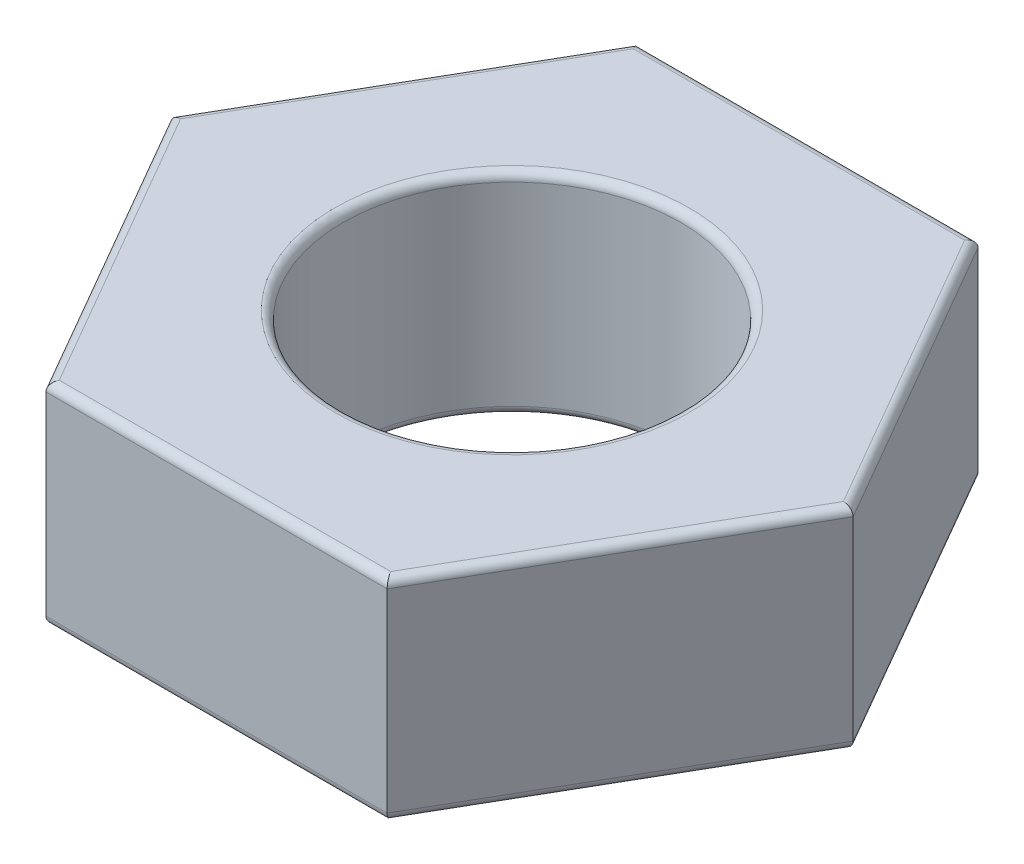
ISO-10303-21;
HEADER;
FILE_DESCRIPTION(('STEP AP214'),'2;1');
FILE_NAME('part.step','',(''),(''),'','','');
FILE_SCHEMA(('AUTOMOTIVE_DESIGN { 1 0 10303 214 1 1 1 1 }'));
ENDSEC;
DATA;
#1=APPLICATION_CONTEXT('core data for automotive mechanical design processes');
#2=APPLICATION_PROTOCOL_DEFINITION('international standard','automotive_design',2000,#1);
#3=PRODUCT_CONTEXT('',#1,'mechanical');
#4=PRODUCT('Part','Part','',(#3));
#5=PRODUCT_RELATED_PRODUCT_CATEGORY('part','',(#4));
#6=PRODUCT_DEFINITION_FORMATION('','',#4);
#7=PRODUCT_DEFINITION_CONTEXT('part definition',#1,'design');
#8=PRODUCT_DEFINITION('design','',#6,#7);
#9=PRODUCT_DEFINITION_SHAPE('','',#8);
#10=(LENGTH_UNIT() NAMED_UNIT(*) SI_UNIT(.MILLI.,.METRE.));
#11=(NAMED_UNIT(*) PLANE_ANGLE_UNIT() SI_UNIT($,.RADIAN.));
#12=(NAMED_UNIT(*) SI_UNIT($,.STERADIAN.) SOLID_ANGLE_UNIT());
#13=UNCERTAINTY_MEASURE_WITH_UNIT(LENGTH_MEASURE(1.E-05),#10,'distance_accuracy_value','');
#14=(GEOMETRIC_REPRESENTATION_CONTEXT(3) GLOBAL_UNCERTAINTY_ASSIGNED_CONTEXT((#13)) GLOBAL_UNIT_ASSIGNED_CONTEXT((#10,
#11,#12)) REPRESENTATION_CONTEXT('',''));
#15=CARTESIAN_POINT('',(0.,0.,0.));
#16=DIRECTION('',(0.,0.,1.));
#17=DIRECTION('',(1.,0.,0.));
#18=AXIS2_PLACEMENT_3D('',#15,#16,#17);
#19=CARTESIAN_POINT('',(0.,2.5,0.));
#20=DIRECTION('',(0.,1.,0.));
#21=DIRECTION('',(0.,0.,1.));
#22=AXIS2_PLACEMENT_3D('',#19,#20,#21);
#23=PLANE('',#22);
#24=CARTESIAN_POINT('',(0.,2.5,0.));
#25=DIRECTION('',(0.,1.,0.));
#26=DIRECTION('',(0.,0.,1.));
#27=AXIS2_PLACEMENT_3D('',#24,#25,#26);
#28=CIRCLE('',#27,2.1);
#29=CARTESIAN_POINT('',(0.,2.5,2.1));
#30=VERTEX_POINT('',#29);
#31=EDGE_CURVE('E11',#30,#30,#28,.F.);
#32=ORIENTED_EDGE('',*,*,#31,.T.);
#33=EDGE_LOOP('',(#32));
#34=FACE_BOUND('',#33,.T.);
#35=DIRECTION('',(-0.5,0.,0.866025403784439));
#36=VECTOR('',#35,1.);
#37=CARTESIAN_POINT('',(-3.95484934394894,2.5,0.0500000000000008));
#38=LINE('',#37,#36);
#39=CARTESIAN_POINT('',(-1.96299091524473,2.5,-3.4));
#40=VERTEX_POINT('',#39);
#41=CARTESIAN_POINT('',(-3.92598183048946,2.5,0.));
#42=VERTEX_POINT('',#41);
#43=EDGE_CURVE('E50',#40,#42,#38,.T.);
#44=ORIENTED_EDGE('',*,*,#43,.T.);
#45=DIRECTION('',(0.5,0.,0.866025403784439));
#46=VECTOR('',#45,1.);
#47=CARTESIAN_POINT('',(-1.93412340178525,2.5,3.45));
#48=LINE('',#47,#46);
#49=CARTESIAN_POINT('',(-1.96299091524473,2.5,3.4));
#50=VERTEX_POINT('',#49);
#51=EDGE_CURVE('E42',#42,#50,#48,.T.);
#52=ORIENTED_EDGE('',*,*,#51,.T.);
#53=DIRECTION('',(1.,0.,0.));
#54=VECTOR('',#53,1.);
#55=CARTESIAN_POINT('',(2.02072594216369,2.5,3.4));
#56=LINE('',#55,#54);
#57=CARTESIAN_POINT('',(1.96299091524473,2.5,3.4));
#58=VERTEX_POINT('',#57);
#59=EDGE_CURVE('E189',#50,#58,#56,.T.);
#60=ORIENTED_EDGE('',*,*,#59,.T.);
#61=DIRECTION('',(0.5,0.,-0.866025403784439));
#62=VECTOR('',#61,1.);
#63=CARTESIAN_POINT('',(3.95484934394894,2.5,-0.0500000000000021));
#64=LINE('',#63,#62);
#65=CARTESIAN_POINT('',(3.92598183048946,2.5,0.));
#66=VERTEX_POINT('',#65);
#67=EDGE_CURVE('E191',#58,#66,#64,.T.);
#68=ORIENTED_EDGE('',*,*,#67,.T.);
#69=DIRECTION('',(-0.5,0.,-0.866025403784438));
#70=VECTOR('',#69,1.);
#71=CARTESIAN_POINT('',(1.93412340178524,2.5,-3.45));
#72=LINE('',#71,#70);
#73=CARTESIAN_POINT('',(1.96299091524473,2.5,-3.4));
#74=VERTEX_POINT('',#73);
#75=EDGE_CURVE('E193',#66,#74,#72,.T.);
#76=ORIENTED_EDGE('',*,*,#75,.T.);
#77=DIRECTION('',(-1.,0.,0.));
#78=VECTOR('',#77,1.);
#79=CARTESIAN_POINT('',(-2.02072594216369,2.5,-3.4));
#80=LINE('',#79,#78);
#81=EDGE_CURVE('E55',#74,#40,#80,.T.);
#82=ORIENTED_EDGE('',*,*,#81,.T.);
#83=EDGE_LOOP('',(#44,#52,#60,#68,#76,#82));
#84=FACE_BOUND('',#83,.T.);
#85=ADVANCED_FACE('F33',(#34,#84),#23,.T.);
#86=CARTESIAN_POINT('',(0.,0.,0.));
#87=DIRECTION('',(0.,1.,0.));
#88=DIRECTION('',(0.,0.,1.));
#89=AXIS2_PLACEMENT_3D('',#86,#87,#88);
#90=PLANE('',#89);
#91=CARTESIAN_POINT('',(0.,0.,0.));
#92=DIRECTION('',(0.,1.,0.));
#93=DIRECTION('',(0.,0.,1.));
#94=AXIS2_PLACEMENT_3D('',#91,#92,#93);
#95=CIRCLE('',#94,2.1);
#96=CARTESIAN_POINT('',(0.,0.,2.1));
#97=VERTEX_POINT('',#96);
#98=EDGE_CURVE('E151',#97,#97,#95,.T.);
#99=ORIENTED_EDGE('',*,*,#98,.T.);
#100=EDGE_LOOP('',(#99));
#101=FACE_BOUND('',#100,.T.);
#102=DIRECTION('',(-0.5,0.,-0.866025403784438));
#103=VECTOR('',#102,1.);
#104=CARTESIAN_POINT('',(2.94448637286709,0.,-1.7));
#105=LINE('',#104,#103);
#106=CARTESIAN_POINT('',(1.96299091524473,0.,-3.4));
#107=VERTEX_POINT('',#106);
#108=CARTESIAN_POINT('',(3.92598183048946,0.,0.));
#109=VERTEX_POINT('',#108);
#110=EDGE_CURVE('E150',#107,#109,#105,.F.);
#111=ORIENTED_EDGE('',*,*,#110,.T.);
#112=DIRECTION('',(0.5,0.,-0.866025403784439));
#113=VECTOR('',#112,1.);
#114=CARTESIAN_POINT('',(2.94448637286709,0.,1.7));
#115=LINE('',#114,#113);
#116=CARTESIAN_POINT('',(1.96299091524473,0.,3.4));
#117=VERTEX_POINT('',#116);
#118=EDGE_CURVE('E129',#109,#117,#115,.F.);
#119=ORIENTED_EDGE('',*,*,#118,.T.);
#120=DIRECTION('',(1.,0.,0.));
#121=VECTOR('',#120,1.);
#122=CARTESIAN_POINT('',(0.,0.,3.4));
#123=LINE('',#122,#121);
#124=CARTESIAN_POINT('',(-1.96299091524473,0.,3.4));
#125=VERTEX_POINT('',#124);
#126=EDGE_CURVE('E139',#117,#125,#123,.F.);
#127=ORIENTED_EDGE('',*,*,#126,.T.);
#128=DIRECTION('',(0.5,0.,0.866025403784439));
#129=VECTOR('',#128,1.);
#130=CARTESIAN_POINT('',(-2.94448637286709,0.,1.7));
#131=LINE('',#130,#129);
#132=CARTESIAN_POINT('',(-3.92598183048946,0.,0.));
#133=VERTEX_POINT('',#132);
#134=EDGE_CURVE('E145',#125,#133,#131,.F.);
#135=ORIENTED_EDGE('',*,*,#134,.T.);
#136=DIRECTION('',(-0.5,0.,0.866025403784439));
#137=VECTOR('',#136,1.);
#138=CARTESIAN_POINT('',(-2.94448637286709,0.,-1.7));
#139=LINE('',#138,#137);
#140=CARTESIAN_POINT('',(-1.96299091524473,0.,-3.4));
#141=VERTEX_POINT('',#140);
#142=EDGE_CURVE('E251',#133,#141,#139,.F.);
#143=ORIENTED_EDGE('',*,*,#142,.T.);
#144=DIRECTION('',(-1.,0.,0.));
#145=VECTOR('',#144,1.);
#146=CARTESIAN_POINT('',(0.,0.,-3.4));
#147=LINE('',#146,#145);
#148=EDGE_CURVE('E156',#141,#107,#147,.F.);
#149=ORIENTED_EDGE('',*,*,#148,.T.);
#150=EDGE_LOOP('',(#111,#119,#127,#135,#143,#149));
#151=FACE_BOUND('',#150,.T.);
#152=ADVANCED_FACE('F148',(#101,#151),#90,.F.);
#153=CARTESIAN_POINT('',(-2.02072594216369,2.5,3.5));
#154=DIRECTION('',(0.,0.,-1.));
#155=DIRECTION('',(-1.,0.,0.));
#156=AXIS2_PLACEMENT_3D('',#153,#154,#155);
#157=PLANE('',#156);
#158=DIRECTION('',(0.,-1.,0.));
#159=VECTOR('',#158,1.);
#160=CARTESIAN_POINT('',(-2.02072594216369,2.5,3.5));
#161=LINE('',#160,#159);
#162=CARTESIAN_POINT('',(-2.02072594216369,2.4,3.5));
#163=VERTEX_POINT('',#162);
#164=CARTESIAN_POINT('',(-2.02072594216369,0.0999999999999998,3.5));
#165=VERTEX_POINT('',#164);
#166=EDGE_CURVE('E208',#163,#165,#161,.T.);
#167=ORIENTED_EDGE('',*,*,#166,.T.);
#168=DIRECTION('',(1.,0.,0.));
#169=VECTOR('',#168,1.);
#170=CARTESIAN_POINT('',(-2.02072594216369,0.0999999999999998,3.5));
#171=LINE('',#170,#169);
#172=CARTESIAN_POINT('',(2.02072594216369,0.0999999999999998,3.5));
#173=VERTEX_POINT('',#172);
#174=EDGE_CURVE('E187',#165,#173,#171,.T.);
#175=ORIENTED_EDGE('',*,*,#174,.T.);
#176=DIRECTION('',(0.,-1.,0.));
#177=VECTOR('',#176,1.);
#178=CARTESIAN_POINT('',(2.02072594216369,2.5,3.5));
#179=LINE('',#178,#177);
#180=CARTESIAN_POINT('',(2.02072594216369,2.4,3.5));
#181=VERTEX_POINT('',#180);
#182=EDGE_CURVE('E146',#181,#173,#179,.T.);
#183=ORIENTED_EDGE('',*,*,#182,.F.);
#184=DIRECTION('',(1.,0.,0.));
#185=VECTOR('',#184,1.);
#186=CARTESIAN_POINT('',(-2.02072594216369,2.4,3.5));
#187=LINE('',#186,#185);
#188=EDGE_CURVE('E185',#181,#163,#187,.F.);
#189=ORIENTED_EDGE('',*,*,#188,.T.);
#190=EDGE_LOOP('',(#167,#175,#183,#189));
#191=FACE_BOUND('',#190,.T.);
#192=ADVANCED_FACE('F275',(#191),#157,.F.);
#193=CARTESIAN_POINT('',(2.02072594216369,2.5,3.5));
#194=DIRECTION('',(-0.866025403784439,0.,-0.5));
#195=DIRECTION('',(-0.5,0.,0.866025403784439));
#196=AXIS2_PLACEMENT_3D('',#193,#194,#195);
#197=PLANE('',#196);
#198=ORIENTED_EDGE('',*,*,#182,.T.);
#199=DIRECTION('',(0.5,0.,-0.866025403784439));
#200=VECTOR('',#199,1.);
#201=CARTESIAN_POINT('',(2.02072594216369,0.0999999999999998,3.5));
#202=LINE('',#201,#200);
#203=CARTESIAN_POINT('',(4.04145188432738,0.0999999999999998,0.));
#204=VERTEX_POINT('',#203);
#205=EDGE_CURVE('E132',#173,#204,#202,.T.);
#206=ORIENTED_EDGE('',*,*,#205,.T.);
#207=DIRECTION('',(0.,-1.,0.));
#208=VECTOR('',#207,1.);
#209=CARTESIAN_POINT('',(4.04145188432738,2.5,0.));
#210=LINE('',#209,#208);
#211=CARTESIAN_POINT('',(4.04145188432738,2.4,0.));
#212=VERTEX_POINT('',#211);
#213=EDGE_CURVE('E237',#212,#204,#210,.T.);
#214=ORIENTED_EDGE('',*,*,#213,.F.);
#215=DIRECTION('',(0.5,0.,-0.866025403784439));
#216=VECTOR('',#215,1.);
#217=CARTESIAN_POINT('',(2.02072594216369,2.4,3.5));
#218=LINE('',#217,#216);
#219=EDGE_CURVE('E165',#212,#181,#218,.F.);
#220=ORIENTED_EDGE('',*,*,#219,.T.);
#221=EDGE_LOOP('',(#198,#206,#214,#220));
#222=FACE_BOUND('',#221,.T.);
#223=ADVANCED_FACE('F242',(#222),#197,.F.);
#224=CARTESIAN_POINT('',(4.04145188432738,2.5,0.));
#225=DIRECTION('',(-0.866025403784438,0.,0.5));
#226=DIRECTION('',(0.5,0.,0.866025403784438));
#227=AXIS2_PLACEMENT_3D('',#224,#225,#226);
#228=PLANE('',#227);
#229=ORIENTED_EDGE('',*,*,#213,.T.);
#230=DIRECTION('',(-0.5,0.,-0.866025403784438));
#231=VECTOR('',#230,1.);
#232=CARTESIAN_POINT('',(4.04145188432738,0.0999999999999998,0.));
#233=LINE('',#232,#231);
#234=CARTESIAN_POINT('',(2.02072594216369,0.0999999999999998,-3.5));
#235=VERTEX_POINT('',#234);
#236=EDGE_CURVE('E170',#204,#235,#233,.T.);
#237=ORIENTED_EDGE('',*,*,#236,.T.);
#238=DIRECTION('',(0.,-1.,0.));
#239=VECTOR('',#238,1.);
#240=CARTESIAN_POINT('',(2.02072594216369,2.5,-3.5));
#241=LINE('',#240,#239);
#242=CARTESIAN_POINT('',(2.02072594216369,2.4,-3.5));
#243=VERTEX_POINT('',#242);
#244=EDGE_CURVE('E239',#243,#235,#241,.T.);
#245=ORIENTED_EDGE('',*,*,#244,.F.);
#246=DIRECTION('',(-0.5,0.,-0.866025403784438));
#247=VECTOR('',#246,1.);
#248=CARTESIAN_POINT('',(4.04145188432738,2.4,0.));
#249=LINE('',#248,#247);
#250=EDGE_CURVE('E168',#243,#212,#249,.F.);
#251=ORIENTED_EDGE('',*,*,#250,.T.);
#252=EDGE_LOOP('',(#229,#237,#245,#251));
#253=FACE_BOUND('',#252,.T.);
#254=ADVANCED_FACE('F236',(#253),#228,.F.);
#255=CARTESIAN_POINT('',(2.02072594216369,2.5,-3.5));
#256=DIRECTION('',(0.,0.,1.));
#257=DIRECTION('',(1.,0.,0.));
#258=AXIS2_PLACEMENT_3D('',#255,#256,#257);
#259=PLANE('',#258);
#260=ORIENTED_EDGE('',*,*,#244,.T.);
#261=DIRECTION('',(-1.,0.,0.));
#262=VECTOR('',#261,1.);
#263=CARTESIAN_POINT('',(2.02072594216369,0.0999999999999998,-3.5));
#264=LINE('',#263,#262);
#265=CARTESIAN_POINT('',(-2.02072594216369,0.0999999999999998,-3.5));
#266=VERTEX_POINT('',#265);
#267=EDGE_CURVE('E174',#235,#266,#264,.T.);
#268=ORIENTED_EDGE('',*,*,#267,.T.);
#269=DIRECTION('',(0.,-1.,0.));
#270=VECTOR('',#269,1.);
#271=CARTESIAN_POINT('',(-2.02072594216369,2.5,-3.5));
#272=LINE('',#271,#270);
#273=CARTESIAN_POINT('',(-2.02072594216369,2.4,-3.5));
#274=VERTEX_POINT('',#273);
#275=EDGE_CURVE('E246',#274,#266,#272,.T.);
#276=ORIENTED_EDGE('',*,*,#275,.F.);
#277=DIRECTION('',(-1.,0.,0.));
#278=VECTOR('',#277,1.);
#279=CARTESIAN_POINT('',(2.02072594216369,2.4,-3.5));
#280=LINE('',#279,#278);
#281=EDGE_CURVE('E172',#274,#243,#280,.F.);
#282=ORIENTED_EDGE('',*,*,#281,.T.);
#283=EDGE_LOOP('',(#260,#268,#276,#282));
#284=FACE_BOUND('',#283,.T.);
#285=ADVANCED_FACE('F263',(#284),#259,.F.);
#286=CARTESIAN_POINT('',(-2.02072594216369,2.5,-3.5));
#287=DIRECTION('',(0.866025403784439,0.,0.5));
#288=DIRECTION('',(0.5,0.,-0.866025403784439));
#289=AXIS2_PLACEMENT_3D('',#286,#287,#288);
#290=PLANE('',#289);
#291=ORIENTED_EDGE('',*,*,#275,.T.);
#292=DIRECTION('',(-0.5,0.,0.866025403784439));
#293=VECTOR('',#292,1.);
#294=CARTESIAN_POINT('',(-2.02072594216369,0.0999999999999998,-3.5));
#295=LINE('',#294,#293);
#296=CARTESIAN_POINT('',(-4.04145188432738,0.0999999999999998,0.));
#297=VERTEX_POINT('',#296);
#298=EDGE_CURVE('E178',#266,#297,#295,.T.);
#299=ORIENTED_EDGE('',*,*,#298,.T.);
#300=DIRECTION('',(0.,-1.,0.));
#301=VECTOR('',#300,1.);
#302=CARTESIAN_POINT('',(-4.04145188432738,2.5,0.));
#303=LINE('',#302,#301);
#304=CARTESIAN_POINT('',(-4.04145188432738,2.4,0.));
#305=VERTEX_POINT('',#304);
#306=EDGE_CURVE('E268',#305,#297,#303,.T.);
#307=ORIENTED_EDGE('',*,*,#306,.F.);
#308=DIRECTION('',(-0.5,0.,0.866025403784439));
#309=VECTOR('',#308,1.);
#310=CARTESIAN_POINT('',(-2.02072594216369,2.4,-3.5));
#311=LINE('',#310,#309);
#312=EDGE_CURVE('E176',#305,#274,#311,.F.);
#313=ORIENTED_EDGE('',*,*,#312,.T.);
#314=EDGE_LOOP('',(#291,#299,#307,#313));
#315=FACE_BOUND('',#314,.T.);
#316=ADVANCED_FACE('F286',(#315),#290,.F.);
#317=CARTESIAN_POINT('',(-4.04145188432738,2.5,0.));
#318=DIRECTION('',(0.866025403784439,0.,-0.5));
#319=DIRECTION('',(-0.5,0.,-0.866025403784439));
#320=AXIS2_PLACEMENT_3D('',#317,#318,#319);
#321=PLANE('',#320);
#322=ORIENTED_EDGE('',*,*,#306,.T.);
#323=DIRECTION('',(0.5,0.,0.866025403784439));
#324=VECTOR('',#323,1.);
#325=CARTESIAN_POINT('',(-4.04145188432738,0.0999999999999998,0.));
#326=LINE('',#325,#324);
#327=EDGE_CURVE('E183',#297,#165,#326,.T.);
#328=ORIENTED_EDGE('',*,*,#327,.T.);
#329=ORIENTED_EDGE('',*,*,#166,.F.);
#330=DIRECTION('',(0.5,0.,0.866025403784439));
#331=VECTOR('',#330,1.);
#332=CARTESIAN_POINT('',(-4.04145188432738,2.4,0.));
#333=LINE('',#332,#331);
#334=EDGE_CURVE('E180',#163,#305,#333,.F.);
#335=ORIENTED_EDGE('',*,*,#334,.T.);
#336=EDGE_LOOP('',(#322,#328,#329,#335));
#337=FACE_BOUND('',#336,.T.);
#338=ADVANCED_FACE('F287',(#337),#321,.F.);
#339=CARTESIAN_POINT('',(0.,2.5,0.));
#340=DIRECTION('',(0.,-1.,0.));
#341=DIRECTION('',(0.,0.,-1.));
#342=AXIS2_PLACEMENT_3D('',#339,#340,#341);
#343=CYLINDRICAL_SURFACE('',#342,2.);
#344=CARTESIAN_POINT('',(0.,0.0999999999999998,0.));
#345=DIRECTION('',(0.,1.,0.));
#346=DIRECTION('',(0.,0.,1.));
#347=AXIS2_PLACEMENT_3D('',#344,#345,#346);
#348=CIRCLE('',#347,2.);
#349=CARTESIAN_POINT('',(0.,0.0999999999999998,2.));
#350=VERTEX_POINT('',#349);
#351=EDGE_CURVE('E162',#350,#350,#348,.F.);
#352=ORIENTED_EDGE('',*,*,#351,.T.);
#353=EDGE_LOOP('',(#352));
#354=FACE_BOUND('',#353,.T.);
#355=CARTESIAN_POINT('',(0.,2.4,0.));
#356=DIRECTION('',(0.,1.,0.));
#357=DIRECTION('',(0.,0.,1.));
#358=AXIS2_PLACEMENT_3D('',#355,#356,#357);
#359=CIRCLE('',#358,2.);
#360=CARTESIAN_POINT('',(0.,2.4,2.));
#361=VERTEX_POINT('',#360);
#362=EDGE_CURVE('E154',#361,#361,#359,.T.);
#363=ORIENTED_EDGE('',*,*,#362,.T.);
#364=EDGE_LOOP('',(#363));
#365=FACE_BOUND('',#364,.T.);
#366=ADVANCED_FACE('F306',(#354,#365),#343,.F.);
#367=CARTESIAN_POINT('',(0.,0.0999999999999998,0.));
#368=DIRECTION('',(0.,1.,0.));
#369=DIRECTION('',(0.,0.,1.));
#370=AXIS2_PLACEMENT_3D('',#367,#368,#369);
#371=TOROIDAL_SURFACE('',#370,2.1,0.1);
#372=ORIENTED_EDGE('',*,*,#351,.F.);
#373=EDGE_LOOP('',(#372));
#374=FACE_BOUND('',#373,.T.);
#375=ORIENTED_EDGE('',*,*,#98,.F.);
#376=EDGE_LOOP('',(#375));
#377=FACE_BOUND('',#376,.T.);
#378=ADVANCED_FACE('F320',(#374,#377),#371,.T.);
#379=CARTESIAN_POINT('',(-1.93412340178525,0.0999999999999998,-3.45));
#380=DIRECTION('',(-0.5,0.,0.866025403784439));
#381=DIRECTION('',(0.866025403784439,0.,0.5));
#382=AXIS2_PLACEMENT_3D('',#379,#380,#381);
#383=CYLINDRICAL_SURFACE('',#382,0.1);
#384=CARTESIAN_POINT('',(-1.96299091524473,0.0999999999999998,-3.4));
#385=DIRECTION('',(-0.866025403784438,0.,0.5));
#386=DIRECTION('',(0.5,0.,0.866025403784439));
#387=AXIS2_PLACEMENT_3D('',#384,#385,#386);
#388=ELLIPSE('',#387,0.115470053837925,0.1);
#389=EDGE_CURVE('E202',#141,#266,#388,.F.);
#390=ORIENTED_EDGE('',*,*,#389,.F.);
#391=ORIENTED_EDGE('',*,*,#142,.F.);
#392=CARTESIAN_POINT('',(-3.92598183048946,0.0999999999999998,0.));
#393=DIRECTION('',(0.,0.,1.));
#394=DIRECTION('',(1.,0.,0.));
#395=AXIS2_PLACEMENT_3D('',#392,#393,#394);
#396=ELLIPSE('',#395,0.115470053837925,0.1);
#397=EDGE_CURVE('E205',#297,#133,#396,.T.);
#398=ORIENTED_EDGE('',*,*,#397,.F.);
#399=ORIENTED_EDGE('',*,*,#298,.F.);
#400=EDGE_LOOP('',(#390,#391,#398,#399));
#401=FACE_BOUND('',#400,.T.);
#402=ADVANCED_FACE('F284',(#401),#383,.T.);
#403=CARTESIAN_POINT('',(-3.95484934394894,0.0999999999999998,-0.0500000000000002));
#404=DIRECTION('',(0.5,0.,0.866025403784439));
#405=DIRECTION('',(0.866025403784439,0.,-0.5));
#406=AXIS2_PLACEMENT_3D('',#403,#404,#405);
#407=CYLINDRICAL_SURFACE('',#406,0.1);
#408=ORIENTED_EDGE('',*,*,#397,.T.);
#409=ORIENTED_EDGE('',*,*,#134,.F.);
#410=CARTESIAN_POINT('',(-1.96299091524473,0.0999999999999998,3.4));
#411=DIRECTION('',(0.866025403784439,0.,0.5));
#412=DIRECTION('',(0.5,0.,-0.866025403784439));
#413=AXIS2_PLACEMENT_3D('',#410,#411,#412);
#414=ELLIPSE('',#413,0.115470053837925,0.1);
#415=EDGE_CURVE('E142',#165,#125,#414,.T.);
#416=ORIENTED_EDGE('',*,*,#415,.F.);
#417=ORIENTED_EDGE('',*,*,#327,.F.);
#418=EDGE_LOOP('',(#408,#409,#416,#417));
#419=FACE_BOUND('',#418,.T.);
#420=ADVANCED_FACE('F281',(#419),#407,.T.);
#421=CARTESIAN_POINT('',(2.02072594216369,0.0999999999999998,-3.4));
#422=DIRECTION('',(-1.,0.,0.));
#423=DIRECTION('',(0.,0.,1.));
#424=AXIS2_PLACEMENT_3D('',#421,#422,#423);
#425=CYLINDRICAL_SURFACE('',#424,0.1);
#426=ORIENTED_EDGE('',*,*,#389,.T.);
#427=ORIENTED_EDGE('',*,*,#267,.F.);
#428=CARTESIAN_POINT('',(1.96299091524472,0.0999999999999998,-3.4));
#429=DIRECTION('',(-0.866025403784439,0.,-0.5));
#430=DIRECTION('',(-0.5,0.,0.866025403784439));
#431=AXIS2_PLACEMENT_3D('',#428,#429,#430);
#432=ELLIPSE('',#431,0.115470053837925,0.1);
#433=EDGE_CURVE('E135',#107,#235,#432,.F.);
#434=ORIENTED_EDGE('',*,*,#433,.F.);
#435=ORIENTED_EDGE('',*,*,#148,.F.);
#436=EDGE_LOOP('',(#426,#427,#434,#435));
#437=FACE_BOUND('',#436,.T.);
#438=ADVANCED_FACE('F258',(#437),#425,.T.);
#439=CARTESIAN_POINT('',(-2.02072594216369,0.0999999999999998,3.4));
#440=DIRECTION('',(1.,0.,0.));
#441=DIRECTION('',(0.,0.,-1.));
#442=AXIS2_PLACEMENT_3D('',#439,#440,#441);
#443=CYLINDRICAL_SURFACE('',#442,0.1);
#444=ORIENTED_EDGE('',*,*,#415,.T.);
#445=ORIENTED_EDGE('',*,*,#126,.F.);
#446=CARTESIAN_POINT('',(1.96299091524473,0.0999999999999998,3.4));
#447=DIRECTION('',(0.866025403784438,0.,-0.5));
#448=DIRECTION('',(0.5,0.,0.866025403784439));
#449=AXIS2_PLACEMENT_3D('',#446,#447,#448);
#450=ELLIPSE('',#449,0.115470053837925,0.1);
#451=EDGE_CURVE('E125',#173,#117,#450,.T.);
#452=ORIENTED_EDGE('',*,*,#451,.F.);
#453=ORIENTED_EDGE('',*,*,#174,.F.);
#454=EDGE_LOOP('',(#444,#445,#452,#453));
#455=FACE_BOUND('',#454,.T.);
#456=ADVANCED_FACE('F140',(#455),#443,.T.);
#457=CARTESIAN_POINT('',(3.95484934394894,0.0999999999999998,0.0499999999999988));
#458=DIRECTION('',(-0.5,0.,-0.866025403784438));
#459=DIRECTION('',(-0.866025403784438,0.,0.5));
#460=AXIS2_PLACEMENT_3D('',#457,#458,#459);
#461=CYLINDRICAL_SURFACE('',#460,0.1);
#462=ORIENTED_EDGE('',*,*,#433,.T.);
#463=ORIENTED_EDGE('',*,*,#236,.F.);
#464=CARTESIAN_POINT('',(3.92598183048946,0.0999999999999998,0.));
#465=DIRECTION('',(0.,0.,-1.));
#466=DIRECTION('',(-1.,0.,0.));
#467=AXIS2_PLACEMENT_3D('',#464,#465,#466);
#468=ELLIPSE('',#467,0.115470053837925,0.1);
#469=EDGE_CURVE('E136',#109,#204,#468,.F.);
#470=ORIENTED_EDGE('',*,*,#469,.F.);
#471=ORIENTED_EDGE('',*,*,#110,.F.);
#472=EDGE_LOOP('',(#462,#463,#470,#471));
#473=FACE_BOUND('',#472,.T.);
#474=ADVANCED_FACE('F261',(#473),#461,.T.);
#475=CARTESIAN_POINT('',(1.93412340178525,0.0999999999999998,3.45));
#476=DIRECTION('',(0.5,0.,-0.866025403784439));
#477=DIRECTION('',(-0.866025403784439,0.,-0.5));
#478=AXIS2_PLACEMENT_3D('',#475,#476,#477);
#479=CYLINDRICAL_SURFACE('',#478,0.1);
#480=ORIENTED_EDGE('',*,*,#451,.T.);
#481=ORIENTED_EDGE('',*,*,#118,.F.);
#482=ORIENTED_EDGE('',*,*,#469,.T.);
#483=ORIENTED_EDGE('',*,*,#205,.F.);
#484=EDGE_LOOP('',(#480,#481,#482,#483));
#485=FACE_BOUND('',#484,.T.);
#486=ADVANCED_FACE('F127',(#485),#479,.T.);
#487=CARTESIAN_POINT('',(0.,2.4,0.));
#488=DIRECTION('',(0.,1.,0.));
#489=DIRECTION('',(0.,0.,1.));
#490=AXIS2_PLACEMENT_3D('',#487,#488,#489);
#491=TOROIDAL_SURFACE('',#490,2.1,0.1);
#492=ORIENTED_EDGE('',*,*,#31,.F.);
#493=EDGE_LOOP('',(#492));
#494=FACE_BOUND('',#493,.T.);
#495=ORIENTED_EDGE('',*,*,#362,.F.);
#496=EDGE_LOOP('',(#495));
#497=FACE_BOUND('',#496,.T.);
#498=ADVANCED_FACE('F326',(#494,#497),#491,.T.);
#499=CARTESIAN_POINT('',(2.94448637286709,2.4,-1.7));
#500=DIRECTION('',(0.5,0.,0.866025403784438));
#501=DIRECTION('',(0.866025403784438,0.,-0.5));
#502=AXIS2_PLACEMENT_3D('',#499,#500,#501);
#503=CYLINDRICAL_SURFACE('',#502,0.1);
#504=CARTESIAN_POINT('',(3.92598183048946,2.4,0.));
#505=DIRECTION('',(0.,0.,1.));
#506=DIRECTION('',(-1.,0.,0.));
#507=AXIS2_PLACEMENT_3D('',#504,#505,#506);
#508=ELLIPSE('',#507,0.115470053837925,0.1);
#509=EDGE_CURVE('E218',#212,#66,#508,.T.);
#510=ORIENTED_EDGE('',*,*,#509,.F.);
#511=ORIENTED_EDGE('',*,*,#250,.F.);
#512=CARTESIAN_POINT('',(1.96299091524472,2.4,-3.4));
#513=DIRECTION('',(0.866025403784439,0.,0.5));
#514=DIRECTION('',(-0.5,0.,0.866025403784439));
#515=AXIS2_PLACEMENT_3D('',#512,#513,#514);
#516=ELLIPSE('',#515,0.115470053837925,0.1);
#517=EDGE_CURVE('E37',#74,#243,#516,.F.);
#518=ORIENTED_EDGE('',*,*,#517,.F.);
#519=ORIENTED_EDGE('',*,*,#75,.F.);
#520=EDGE_LOOP('',(#510,#511,#518,#519));
#521=FACE_BOUND('',#520,.T.);
#522=ADVANCED_FACE('F35',(#521),#503,.T.);
#523=CARTESIAN_POINT('',(0.,2.4,-3.4));
#524=DIRECTION('',(1.,0.,0.));
#525=DIRECTION('',(0.,0.,-1.));
#526=AXIS2_PLACEMENT_3D('',#523,#524,#525);
#527=CYLINDRICAL_SURFACE('',#526,0.1);
#528=ORIENTED_EDGE('',*,*,#517,.T.);
#529=ORIENTED_EDGE('',*,*,#281,.F.);
#530=CARTESIAN_POINT('',(-1.96299091524473,2.4,-3.4));
#531=DIRECTION('',(0.866025403784438,0.,-0.5));
#532=DIRECTION('',(0.5,0.,0.866025403784439));
#533=AXIS2_PLACEMENT_3D('',#530,#531,#532);
#534=ELLIPSE('',#533,0.115470053837925,0.1);
#535=EDGE_CURVE('E216',#40,#274,#534,.F.);
#536=ORIENTED_EDGE('',*,*,#535,.F.);
#537=ORIENTED_EDGE('',*,*,#81,.F.);
#538=EDGE_LOOP('',(#528,#529,#536,#537));
#539=FACE_BOUND('',#538,.T.);
#540=ADVANCED_FACE('F228',(#539),#527,.T.);
#541=CARTESIAN_POINT('',(2.94448637286709,2.4,1.7));
#542=DIRECTION('',(-0.5,0.,0.866025403784439));
#543=DIRECTION('',(0.866025403784439,0.,0.5));
#544=AXIS2_PLACEMENT_3D('',#541,#542,#543);
#545=CYLINDRICAL_SURFACE('',#544,0.1);
#546=ORIENTED_EDGE('',*,*,#509,.T.);
#547=ORIENTED_EDGE('',*,*,#67,.F.);
#548=CARTESIAN_POINT('',(1.96299091524473,2.4,3.4));
#549=DIRECTION('',(-0.866025403784438,0.,0.5));
#550=DIRECTION('',(-0.5,0.,-0.866025403784439));
#551=AXIS2_PLACEMENT_3D('',#548,#549,#550);
#552=ELLIPSE('',#551,0.115470053837925,0.1);
#553=EDGE_CURVE('E213',#181,#58,#552,.T.);
#554=ORIENTED_EDGE('',*,*,#553,.F.);
#555=ORIENTED_EDGE('',*,*,#219,.F.);
#556=EDGE_LOOP('',(#546,#547,#554,#555));
#557=FACE_BOUND('',#556,.T.);
#558=ADVANCED_FACE('F347',(#557),#545,.T.);
#559=CARTESIAN_POINT('',(-2.94448637286709,2.4,-1.7));
#560=DIRECTION('',(0.5,0.,-0.866025403784439));
#561=DIRECTION('',(-0.866025403784439,0.,-0.5));
#562=AXIS2_PLACEMENT_3D('',#559,#560,#561);
#563=CYLINDRICAL_SURFACE('',#562,0.1);
#564=ORIENTED_EDGE('',*,*,#535,.T.);
#565=ORIENTED_EDGE('',*,*,#312,.F.);
#566=CARTESIAN_POINT('',(-3.92598183048946,2.4,0.));
#567=DIRECTION('',(0.,0.,-1.));
#568=DIRECTION('',(1.,0.,0.));
#569=AXIS2_PLACEMENT_3D('',#566,#567,#568);
#570=ELLIPSE('',#569,0.115470053837925,0.1);
#571=EDGE_CURVE('E211',#42,#305,#570,.F.);
#572=ORIENTED_EDGE('',*,*,#571,.F.);
#573=ORIENTED_EDGE('',*,*,#43,.F.);
#574=EDGE_LOOP('',(#564,#565,#572,#573));
#575=FACE_BOUND('',#574,.T.);
#576=ADVANCED_FACE('F344',(#575),#563,.T.);
#577=CARTESIAN_POINT('',(0.,2.4,3.4));
#578=DIRECTION('',(-1.,0.,0.));
#579=DIRECTION('',(0.,0.,1.));
#580=AXIS2_PLACEMENT_3D('',#577,#578,#579);
#581=CYLINDRICAL_SURFACE('',#580,0.1);
#582=ORIENTED_EDGE('',*,*,#553,.T.);
#583=ORIENTED_EDGE('',*,*,#59,.F.);
#584=CARTESIAN_POINT('',(-1.96299091524473,2.4,3.4));
#585=DIRECTION('',(-0.866025403784439,0.,-0.5));
#586=DIRECTION('',(-0.5,0.,0.866025403784439));
#587=AXIS2_PLACEMENT_3D('',#584,#585,#586);
#588=ELLIPSE('',#587,0.115470053837925,0.1);
#589=EDGE_CURVE('E209',#163,#50,#588,.T.);
#590=ORIENTED_EDGE('',*,*,#589,.F.);
#591=ORIENTED_EDGE('',*,*,#188,.F.);
#592=EDGE_LOOP('',(#582,#583,#590,#591));
#593=FACE_BOUND('',#592,.T.);
#594=ADVANCED_FACE('F295',(#593),#581,.T.);
#595=CARTESIAN_POINT('',(-2.94448637286709,2.4,1.7));
#596=DIRECTION('',(-0.5,0.,-0.866025403784439));
#597=DIRECTION('',(-0.866025403784439,0.,0.5));
#598=AXIS2_PLACEMENT_3D('',#595,#596,#597);
#599=CYLINDRICAL_SURFACE('',#598,0.1);
#600=ORIENTED_EDGE('',*,*,#571,.T.);
#601=ORIENTED_EDGE('',*,*,#334,.F.);
#602=ORIENTED_EDGE('',*,*,#589,.T.);
#603=ORIENTED_EDGE('',*,*,#51,.F.);
#604=EDGE_LOOP('',(#600,#601,#602,#603));
#605=FACE_BOUND('',#604,.T.);
#606=ADVANCED_FACE('F290',(#605),#599,.T.);
#607=CLOSED_SHELL('',(#85,#152,#192,#223,#254,#285,#316,#338,#366,#378,#402,#420,#438,#456,#474,
#486,#498,#522,#540,#558,#576,#594,#606));
#608=MANIFOLD_SOLID_BREP('B2',#607);
#609=ADVANCED_BREP_SHAPE_REPRESENTATION('',(#18,#608),#14);
#610=SHAPE_DEFINITION_REPRESENTATION(#9,#609);
ENDSEC;
END-ISO-10303-21;
